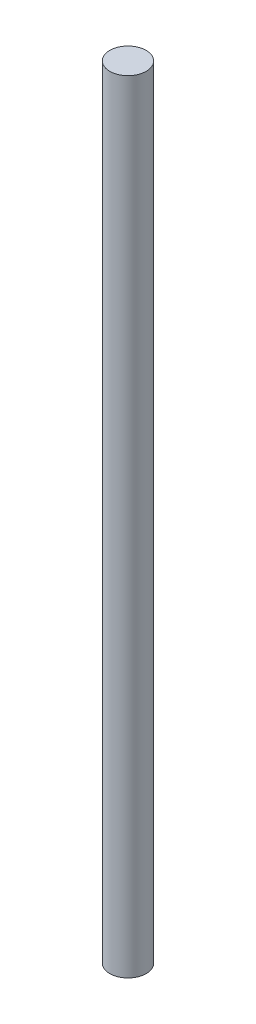
ISO-10303-21;
HEADER;
FILE_DESCRIPTION(('STEP AP214'),'2;1');
FILE_NAME('part.step','',(''),(''),'','','');
FILE_SCHEMA(('AUTOMOTIVE_DESIGN { 1 0 10303 214 1 1 1 1 }'));
ENDSEC;
DATA;
#1=APPLICATION_CONTEXT('core data for automotive mechanical design processes');
#2=APPLICATION_PROTOCOL_DEFINITION('international standard','automotive_design',2000,#1);
#3=PRODUCT_CONTEXT('',#1,'mechanical');
#4=PRODUCT('Part','Part','',(#3));
#5=PRODUCT_RELATED_PRODUCT_CATEGORY('part','',(#4));
#6=PRODUCT_DEFINITION_FORMATION('','',#4);
#7=PRODUCT_DEFINITION_CONTEXT('part definition',#1,'design');
#8=PRODUCT_DEFINITION('design','',#6,#7);
#9=PRODUCT_DEFINITION_SHAPE('','',#8);
#10=(LENGTH_UNIT() NAMED_UNIT(*) SI_UNIT(.MILLI.,.METRE.));
#11=(NAMED_UNIT(*) PLANE_ANGLE_UNIT() SI_UNIT($,.RADIAN.));
#12=(NAMED_UNIT(*) SI_UNIT($,.STERADIAN.) SOLID_ANGLE_UNIT());
#13=UNCERTAINTY_MEASURE_WITH_UNIT(LENGTH_MEASURE(1.E-05),#10,'distance_accuracy_value','');
#14=(GEOMETRIC_REPRESENTATION_CONTEXT(3) GLOBAL_UNCERTAINTY_ASSIGNED_CONTEXT((#13)) GLOBAL_UNIT_ASSIGNED_CONTEXT((#10,
#11,#12)) REPRESENTATION_CONTEXT('',''));
#15=CARTESIAN_POINT('',(0.,0.,0.));
#16=DIRECTION('',(0.,0.,1.));
#17=DIRECTION('',(1.,0.,0.));
#18=AXIS2_PLACEMENT_3D('',#15,#16,#17);
#19=CARTESIAN_POINT('',(0.,43.,0.));
#20=DIRECTION('',(0.,-1.,0.));
#21=DIRECTION('',(0.,0.,-1.));
#22=AXIS2_PLACEMENT_3D('',#19,#20,#21);
#23=CYLINDRICAL_SURFACE('',#22,1.);
#24=CARTESIAN_POINT('',(0.,43.,0.));
#25=DIRECTION('',(0.,1.,0.));
#26=DIRECTION('',(0.,0.,1.));
#27=AXIS2_PLACEMENT_3D('',#24,#25,#26);
#28=CIRCLE('',#27,1.);
#29=CARTESIAN_POINT('',(0.,43.,1.));
#30=VERTEX_POINT('',#29);
#31=EDGE_CURVE('E10',#30,#30,#28,.T.);
#32=ORIENTED_EDGE('',*,*,#31,.F.);
#33=EDGE_LOOP('',(#32));
#34=FACE_BOUND('',#33,.T.);
#35=CARTESIAN_POINT('',(0.,0.,0.));
#36=DIRECTION('',(0.,1.,0.));
#37=DIRECTION('',(0.,0.,1.));
#38=AXIS2_PLACEMENT_3D('',#35,#36,#37);
#39=CIRCLE('',#38,1.);
#40=CARTESIAN_POINT('',(0.,0.,1.));
#41=VERTEX_POINT('',#40);
#42=EDGE_CURVE('E42',#41,#41,#39,.T.);
#43=ORIENTED_EDGE('',*,*,#42,.T.);
#44=EDGE_LOOP('',(#43));
#45=FACE_BOUND('',#44,.T.);
#46=ADVANCED_FACE('F39',(#34,#45),#23,.T.);
#47=CARTESIAN_POINT('',(0.,43.,0.));
#48=DIRECTION('',(0.,1.,0.));
#49=DIRECTION('',(0.,0.,1.));
#50=AXIS2_PLACEMENT_3D('',#47,#48,#49);
#51=PLANE('',#50);
#52=ORIENTED_EDGE('',*,*,#31,.T.);
#53=EDGE_LOOP('',(#52));
#54=FACE_BOUND('',#53,.T.);
#55=ADVANCED_FACE('F54',(#54),#51,.T.);
#56=CARTESIAN_POINT('',(0.,0.,0.));
#57=DIRECTION('',(0.,1.,0.));
#58=DIRECTION('',(0.,0.,1.));
#59=AXIS2_PLACEMENT_3D('',#56,#57,#58);
#60=PLANE('',#59);
#61=ORIENTED_EDGE('',*,*,#42,.F.);
#62=EDGE_LOOP('',(#61));
#63=FACE_BOUND('',#62,.T.);
#64=ADVANCED_FACE('F52',(#63),#60,.F.);
#65=CLOSED_SHELL('',(#46,#55,#64));
#66=MANIFOLD_SOLID_BREP('B2',#65);
#67=ADVANCED_BREP_SHAPE_REPRESENTATION('',(#18,#66),#14);
#68=SHAPE_DEFINITION_REPRESENTATION(#9,#67);
ENDSEC;
END-ISO-10303-21;
